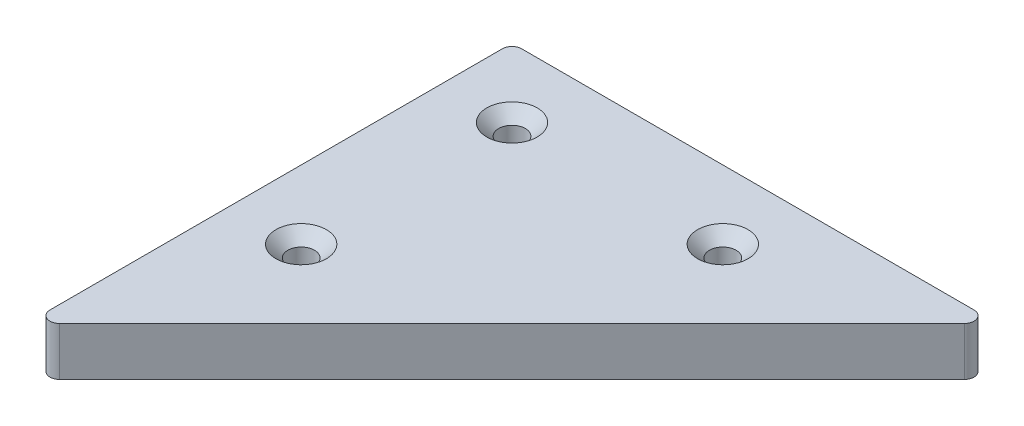
ISO-10303-21;
HEADER;
FILE_DESCRIPTION(('STEP AP214'),'2;1');
FILE_NAME('part.step','',(''),(''),'','','');
FILE_SCHEMA(('AUTOMOTIVE_DESIGN { 1 0 10303 214 1 1 1 1 }'));
ENDSEC;
DATA;
#1=APPLICATION_CONTEXT('core data for automotive mechanical design processes');
#2=APPLICATION_PROTOCOL_DEFINITION('international standard','automotive_design',2000,#1);
#3=PRODUCT_CONTEXT('',#1,'mechanical');
#4=PRODUCT('Part','Part','',(#3));
#5=PRODUCT_RELATED_PRODUCT_CATEGORY('part','',(#4));
#6=PRODUCT_DEFINITION_FORMATION('','',#4);
#7=PRODUCT_DEFINITION_CONTEXT('part definition',#1,'design');
#8=PRODUCT_DEFINITION('design','',#6,#7);
#9=PRODUCT_DEFINITION_SHAPE('','',#8);
#10=(LENGTH_UNIT() NAMED_UNIT(*) SI_UNIT(.MILLI.,.METRE.));
#11=(NAMED_UNIT(*) PLANE_ANGLE_UNIT() SI_UNIT($,.RADIAN.));
#12=(NAMED_UNIT(*) SI_UNIT($,.STERADIAN.) SOLID_ANGLE_UNIT());
#13=UNCERTAINTY_MEASURE_WITH_UNIT(LENGTH_MEASURE(1.E-05),#10,'distance_accuracy_value','');
#14=(GEOMETRIC_REPRESENTATION_CONTEXT(3) GLOBAL_UNCERTAINTY_ASSIGNED_CONTEXT((#13)) GLOBAL_UNIT_ASSIGNED_CONTEXT((#10,
#11,#12)) REPRESENTATION_CONTEXT('',''));
#15=CARTESIAN_POINT('',(0.,0.,0.));
#16=DIRECTION('',(0.,0.,1.));
#17=DIRECTION('',(1.,0.,0.));
#18=AXIS2_PLACEMENT_3D('',#15,#16,#17);
#19=CARTESIAN_POINT('',(100.,10.,0.));
#20=DIRECTION('',(0.,0.,1.));
#21=DIRECTION('',(1.,0.,0.));
#22=AXIS2_PLACEMENT_3D('',#19,#20,#21);
#23=PLANE('',#22);
#24=DIRECTION('',(-1.,0.,0.));
#25=VECTOR('',#24,1.);
#26=CARTESIAN_POINT('',(100.,0.,0.));
#27=LINE('',#26,#25);
#28=CARTESIAN_POINT('',(95.1715728752538,0.,0.));
#29=VERTEX_POINT('',#28);
#30=CARTESIAN_POINT('',(2.,0.,0.));
#31=VERTEX_POINT('',#30);
#32=EDGE_CURVE('E113',#29,#31,#27,.T.);
#33=ORIENTED_EDGE('',*,*,#32,.T.);
#34=DIRECTION('',(0.,-1.,0.));
#35=VECTOR('',#34,1.);
#36=CARTESIAN_POINT('',(2.,10.,0.));
#37=LINE('',#36,#35);
#38=CARTESIAN_POINT('',(2.,10.,0.));
#39=VERTEX_POINT('',#38);
#40=EDGE_CURVE('E92',#31,#39,#37,.F.);
#41=ORIENTED_EDGE('',*,*,#40,.T.);
#42=DIRECTION('',(-1.,0.,0.));
#43=VECTOR('',#42,1.);
#44=CARTESIAN_POINT('',(100.,10.,0.));
#45=LINE('',#44,#43);
#46=CARTESIAN_POINT('',(95.1715728752538,10.,0.));
#47=VERTEX_POINT('',#46);
#48=EDGE_CURVE('E115',#47,#39,#45,.T.);
#49=ORIENTED_EDGE('',*,*,#48,.F.);
#50=DIRECTION('',(0.,-1.,0.));
#51=VECTOR('',#50,1.);
#52=CARTESIAN_POINT('',(95.1715728752538,10.,0.));
#53=LINE('',#52,#51);
#54=EDGE_CURVE('E97',#47,#29,#53,.T.);
#55=ORIENTED_EDGE('',*,*,#54,.T.);
#56=EDGE_LOOP('',(#33,#41,#49,#55));
#57=FACE_BOUND('',#56,.T.);
#58=ADVANCED_FACE('F34',(#57),#23,.F.);
#59=CARTESIAN_POINT('',(0.,10.,0.));
#60=DIRECTION('',(1.,0.,0.));
#61=DIRECTION('',(0.,0.,-1.));
#62=AXIS2_PLACEMENT_3D('',#59,#60,#61);
#63=PLANE('',#62);
#64=DIRECTION('',(0.,0.,1.));
#65=VECTOR('',#64,1.);
#66=CARTESIAN_POINT('',(0.,10.,0.));
#67=LINE('',#66,#65);
#68=CARTESIAN_POINT('',(0.,10.,2.));
#69=VERTEX_POINT('',#68);
#70=CARTESIAN_POINT('',(0.,10.,95.1715728752538));
#71=VERTEX_POINT('',#70);
#72=EDGE_CURVE('E106',#69,#71,#67,.T.);
#73=ORIENTED_EDGE('',*,*,#72,.F.);
#74=DIRECTION('',(0.,-1.,0.));
#75=VECTOR('',#74,1.);
#76=CARTESIAN_POINT('',(0.,10.,2.));
#77=LINE('',#76,#75);
#78=CARTESIAN_POINT('',(0.,0.,2.));
#79=VERTEX_POINT('',#78);
#80=EDGE_CURVE('E91',#69,#79,#77,.T.);
#81=ORIENTED_EDGE('',*,*,#80,.T.);
#82=DIRECTION('',(0.,0.,1.));
#83=VECTOR('',#82,1.);
#84=CARTESIAN_POINT('',(0.,0.,0.));
#85=LINE('',#84,#83);
#86=CARTESIAN_POINT('',(0.,0.,95.1715728752538));
#87=VERTEX_POINT('',#86);
#88=EDGE_CURVE('E104',#79,#87,#85,.T.);
#89=ORIENTED_EDGE('',*,*,#88,.T.);
#90=DIRECTION('',(0.,-1.,0.));
#91=VECTOR('',#90,1.);
#92=CARTESIAN_POINT('',(0.,10.,95.1715728752538));
#93=LINE('',#92,#91);
#94=EDGE_CURVE('E108',#87,#71,#93,.F.);
#95=ORIENTED_EDGE('',*,*,#94,.T.);
#96=EDGE_LOOP('',(#73,#81,#89,#95));
#97=FACE_BOUND('',#96,.T.);
#98=ADVANCED_FACE('F103',(#97),#63,.F.);
#99=CARTESIAN_POINT('',(0.,10.,100.));
#100=DIRECTION('',(-0.707106781186548,0.,-0.707106781186547));
#101=DIRECTION('',(-0.707106781186547,0.,0.707106781186548));
#102=AXIS2_PLACEMENT_3D('',#99,#100,#101);
#103=PLANE('',#102);
#104=DIRECTION('',(0.707106781186547,0.,-0.707106781186548));
#105=VECTOR('',#104,1.);
#106=CARTESIAN_POINT('',(0.,0.,100.));
#107=LINE('',#106,#105);
#108=CARTESIAN_POINT('',(3.4142135623731,0.,96.5857864376269));
#109=VERTEX_POINT('',#108);
#110=CARTESIAN_POINT('',(96.5857864376269,0.,3.41421356237309));
#111=VERTEX_POINT('',#110);
#112=EDGE_CURVE('E112',#109,#111,#107,.T.);
#113=ORIENTED_EDGE('',*,*,#112,.T.);
#114=DIRECTION('',(0.,-1.,0.));
#115=VECTOR('',#114,1.);
#116=CARTESIAN_POINT('',(96.5857864376269,10.,3.41421356237309));
#117=LINE('',#116,#115);
#118=CARTESIAN_POINT('',(96.5857864376269,10.,3.41421356237309));
#119=VERTEX_POINT('',#118);
#120=EDGE_CURVE('E11',#111,#119,#117,.F.);
#121=ORIENTED_EDGE('',*,*,#120,.T.);
#122=DIRECTION('',(0.707106781186547,0.,-0.707106781186548));
#123=VECTOR('',#122,1.);
#124=CARTESIAN_POINT('',(0.,10.,100.));
#125=LINE('',#124,#123);
#126=CARTESIAN_POINT('',(3.4142135623731,10.,96.5857864376269));
#127=VERTEX_POINT('',#126);
#128=EDGE_CURVE('E121',#127,#119,#125,.T.);
#129=ORIENTED_EDGE('',*,*,#128,.F.);
#130=DIRECTION('',(0.,-1.,0.));
#131=VECTOR('',#130,1.);
#132=CARTESIAN_POINT('',(3.4142135623731,10.,96.5857864376269));
#133=LINE('',#132,#131);
#134=EDGE_CURVE('E42',#127,#109,#133,.T.);
#135=ORIENTED_EDGE('',*,*,#134,.T.);
#136=EDGE_LOOP('',(#113,#121,#129,#135));
#137=FACE_BOUND('',#136,.T.);
#138=ADVANCED_FACE('F134',(#137),#103,.F.);
#139=CARTESIAN_POINT('',(0.,10.,0.));
#140=DIRECTION('',(0.,1.,0.));
#141=DIRECTION('',(0.,0.,1.));
#142=AXIS2_PLACEMENT_3D('',#139,#140,#141);
#143=PLANE('',#142);
#144=CARTESIAN_POINT('',(14.1421356237309,10.,14.1421356237309));
#145=DIRECTION('',(0.,1.,0.));
#146=DIRECTION('',(0.,0.,1.));
#147=AXIS2_PLACEMENT_3D('',#144,#145,#146);
#148=CIRCLE('',#147,5.2);
#149=CARTESIAN_POINT('',(14.1421356237309,10.,19.342135623731));
#150=VERTEX_POINT('',#149);
#151=EDGE_CURVE('E299',#150,#150,#148,.T.);
#152=ORIENTED_EDGE('',*,*,#151,.F.);
#153=EDGE_LOOP('',(#152));
#154=FACE_BOUND('',#153,.T.);
#155=CARTESIAN_POINT('',(14.1421356237309,10.,57.5735931288072));
#156=DIRECTION('',(0.,1.,0.));
#157=DIRECTION('',(0.,0.,1.));
#158=AXIS2_PLACEMENT_3D('',#155,#156,#157);
#159=CIRCLE('',#158,5.2);
#160=CARTESIAN_POINT('',(14.1421356237309,10.,62.7735931288072));
#161=VERTEX_POINT('',#160);
#162=EDGE_CURVE('E290',#161,#161,#159,.T.);
#163=ORIENTED_EDGE('',*,*,#162,.F.);
#164=EDGE_LOOP('',(#163));
#165=FACE_BOUND('',#164,.T.);
#166=CARTESIAN_POINT('',(57.5735931288072,10.,14.142135623731));
#167=DIRECTION('',(0.,1.,0.));
#168=DIRECTION('',(0.,0.,1.));
#169=AXIS2_PLACEMENT_3D('',#166,#167,#168);
#170=CIRCLE('',#169,5.2);
#171=CARTESIAN_POINT('',(57.5735931288072,10.,19.342135623731));
#172=VERTEX_POINT('',#171);
#173=EDGE_CURVE('E280',#172,#172,#170,.T.);
#174=ORIENTED_EDGE('',*,*,#173,.F.);
#175=EDGE_LOOP('',(#174));
#176=FACE_BOUND('',#175,.T.);
#177=ORIENTED_EDGE('',*,*,#48,.T.);
#178=CARTESIAN_POINT('',(2.,10.,2.));
#179=DIRECTION('',(0.,1.,0.));
#180=DIRECTION('',(0.,0.,1.));
#181=AXIS2_PLACEMENT_3D('',#178,#179,#180);
#182=CIRCLE('',#181,2.);
#183=EDGE_CURVE('E131',#39,#69,#182,.T.);
#184=ORIENTED_EDGE('',*,*,#183,.T.);
#185=ORIENTED_EDGE('',*,*,#72,.T.);
#186=CARTESIAN_POINT('',(2.00000000000001,10.,95.1715728752538));
#187=DIRECTION('',(0.,1.,0.));
#188=DIRECTION('',(0.,0.,1.));
#189=AXIS2_PLACEMENT_3D('',#186,#187,#188);
#190=CIRCLE('',#189,2.);
#191=EDGE_CURVE('E54',#71,#127,#190,.T.);
#192=ORIENTED_EDGE('',*,*,#191,.T.);
#193=ORIENTED_EDGE('',*,*,#128,.T.);
#194=CARTESIAN_POINT('',(95.1715728752538,10.,2.));
#195=DIRECTION('',(0.,1.,0.));
#196=DIRECTION('',(0.,0.,1.));
#197=AXIS2_PLACEMENT_3D('',#194,#195,#196);
#198=CIRCLE('',#197,2.);
#199=EDGE_CURVE('E129',#119,#47,#198,.T.);
#200=ORIENTED_EDGE('',*,*,#199,.T.);
#201=EDGE_LOOP('',(#177,#184,#185,#192,#193,#200));
#202=FACE_BOUND('',#201,.T.);
#203=ADVANCED_FACE('F147',(#154,#165,#176,#202),#143,.T.);
#204=CARTESIAN_POINT('',(0.,0.,0.));
#205=DIRECTION('',(0.,1.,0.));
#206=DIRECTION('',(0.,0.,1.));
#207=AXIS2_PLACEMENT_3D('',#204,#205,#206);
#208=PLANE('',#207);
#209=CARTESIAN_POINT('',(14.1421356237309,0.,14.1421356237309));
#210=DIRECTION('',(0.,1.,0.));
#211=DIRECTION('',(0.,0.,1.));
#212=AXIS2_PLACEMENT_3D('',#209,#210,#211);
#213=CIRCLE('',#212,2.75);
#214=CARTESIAN_POINT('',(14.1421356237309,0.,16.8921356237309));
#215=VERTEX_POINT('',#214);
#216=EDGE_CURVE('E293',#215,#215,#213,.T.);
#217=ORIENTED_EDGE('',*,*,#216,.T.);
#218=EDGE_LOOP('',(#217));
#219=FACE_BOUND('',#218,.T.);
#220=CARTESIAN_POINT('',(14.1421356237309,0.,57.5735931288072));
#221=DIRECTION('',(0.,1.,0.));
#222=DIRECTION('',(0.,0.,1.));
#223=AXIS2_PLACEMENT_3D('',#220,#221,#222);
#224=CIRCLE('',#223,2.75);
#225=CARTESIAN_POINT('',(14.1421356237309,0.,60.3235931288072));
#226=VERTEX_POINT('',#225);
#227=EDGE_CURVE('E282',#226,#226,#224,.T.);
#228=ORIENTED_EDGE('',*,*,#227,.T.);
#229=EDGE_LOOP('',(#228));
#230=FACE_BOUND('',#229,.T.);
#231=CARTESIAN_POINT('',(57.5735931288072,0.,14.142135623731));
#232=DIRECTION('',(0.,1.,0.));
#233=DIRECTION('',(0.,0.,1.));
#234=AXIS2_PLACEMENT_3D('',#231,#232,#233);
#235=CIRCLE('',#234,2.75);
#236=CARTESIAN_POINT('',(57.5735931288072,0.,16.892135623731));
#237=VERTEX_POINT('',#236);
#238=EDGE_CURVE('E117',#237,#237,#235,.T.);
#239=ORIENTED_EDGE('',*,*,#238,.T.);
#240=EDGE_LOOP('',(#239));
#241=FACE_BOUND('',#240,.T.);
#242=ORIENTED_EDGE('',*,*,#88,.F.);
#243=CARTESIAN_POINT('',(2.,0.,2.));
#244=DIRECTION('',(0.,1.,0.));
#245=DIRECTION('',(0.,0.,1.));
#246=AXIS2_PLACEMENT_3D('',#243,#244,#245);
#247=CIRCLE('',#246,2.);
#248=EDGE_CURVE('E87',#79,#31,#247,.F.);
#249=ORIENTED_EDGE('',*,*,#248,.T.);
#250=ORIENTED_EDGE('',*,*,#32,.F.);
#251=CARTESIAN_POINT('',(95.1715728752538,0.,2.));
#252=DIRECTION('',(0.,1.,0.));
#253=DIRECTION('',(0.,0.,1.));
#254=AXIS2_PLACEMENT_3D('',#251,#252,#253);
#255=CIRCLE('',#254,2.);
#256=EDGE_CURVE('E98',#29,#111,#255,.F.);
#257=ORIENTED_EDGE('',*,*,#256,.T.);
#258=ORIENTED_EDGE('',*,*,#112,.F.);
#259=CARTESIAN_POINT('',(2.00000000000001,0.,95.1715728752538));
#260=DIRECTION('',(0.,1.,0.));
#261=DIRECTION('',(0.,0.,1.));
#262=AXIS2_PLACEMENT_3D('',#259,#260,#261);
#263=CIRCLE('',#262,2.);
#264=EDGE_CURVE('E107',#109,#87,#263,.F.);
#265=ORIENTED_EDGE('',*,*,#264,.T.);
#266=EDGE_LOOP('',(#242,#249,#250,#257,#258,#265));
#267=FACE_BOUND('',#266,.T.);
#268=ADVANCED_FACE('F110',(#219,#230,#241,#267),#208,.F.);
#269=CARTESIAN_POINT('',(57.5735931288072,10.,14.142135623731));
#270=DIRECTION('',(0.,1.,0.));
#271=DIRECTION('',(0.,0.,1.));
#272=AXIS2_PLACEMENT_3D('',#269,#270,#271);
#273=CYLINDRICAL_SURFACE('',#272,2.75);
#274=ORIENTED_EDGE('',*,*,#238,.F.);
#275=EDGE_LOOP('',(#274));
#276=FACE_BOUND('',#275,.T.);
#277=CARTESIAN_POINT('',(57.5735931288072,7.55,14.142135623731));
#278=DIRECTION('',(0.,1.,0.));
#279=DIRECTION('',(0.,0.,1.));
#280=AXIS2_PLACEMENT_3D('',#277,#278,#279);
#281=CIRCLE('',#280,2.75);
#282=CARTESIAN_POINT('',(57.5735931288072,7.55,16.892135623731));
#283=VERTEX_POINT('',#282);
#284=EDGE_CURVE('E279',#283,#283,#281,.T.);
#285=ORIENTED_EDGE('',*,*,#284,.T.);
#286=EDGE_LOOP('',(#285));
#287=FACE_BOUND('',#286,.T.);
#288=ADVANCED_FACE('F155',(#276,#287),#273,.F.);
#289=CARTESIAN_POINT('',(57.5735931288072,10.,14.142135623731));
#290=DIRECTION('',(0.,1.,0.));
#291=DIRECTION('',(0.,0.,1.));
#292=AXIS2_PLACEMENT_3D('',#289,#290,#291);
#293=CONICAL_SURFACE('',#292,5.2,0.785398163397449);
#294=ORIENTED_EDGE('',*,*,#284,.F.);
#295=EDGE_LOOP('',(#294));
#296=FACE_BOUND('',#295,.T.);
#297=ORIENTED_EDGE('',*,*,#173,.T.);
#298=EDGE_LOOP('',(#297));
#299=FACE_BOUND('',#298,.T.);
#300=ADVANCED_FACE('F254',(#296,#299),#293,.F.);
#301=CARTESIAN_POINT('',(14.1421356237309,10.,57.5735931288072));
#302=DIRECTION('',(0.,1.,0.));
#303=DIRECTION('',(0.,0.,1.));
#304=AXIS2_PLACEMENT_3D('',#301,#302,#303);
#305=CYLINDRICAL_SURFACE('',#304,2.75);
#306=ORIENTED_EDGE('',*,*,#227,.F.);
#307=EDGE_LOOP('',(#306));
#308=FACE_BOUND('',#307,.T.);
#309=CARTESIAN_POINT('',(14.1421356237309,7.55,57.5735931288072));
#310=DIRECTION('',(0.,1.,0.));
#311=DIRECTION('',(0.,0.,1.));
#312=AXIS2_PLACEMENT_3D('',#309,#310,#311);
#313=CIRCLE('',#312,2.75);
#314=CARTESIAN_POINT('',(14.1421356237309,7.55,60.3235931288072));
#315=VERTEX_POINT('',#314);
#316=EDGE_CURVE('E287',#315,#315,#313,.T.);
#317=ORIENTED_EDGE('',*,*,#316,.T.);
#318=EDGE_LOOP('',(#317));
#319=FACE_BOUND('',#318,.T.);
#320=ADVANCED_FACE('F244',(#308,#319),#305,.F.);
#321=CARTESIAN_POINT('',(14.1421356237309,10.,57.5735931288072));
#322=DIRECTION('',(0.,1.,0.));
#323=DIRECTION('',(0.,0.,1.));
#324=AXIS2_PLACEMENT_3D('',#321,#322,#323);
#325=CONICAL_SURFACE('',#324,5.2,0.785398163397448);
#326=ORIENTED_EDGE('',*,*,#316,.F.);
#327=EDGE_LOOP('',(#326));
#328=FACE_BOUND('',#327,.T.);
#329=ORIENTED_EDGE('',*,*,#162,.T.);
#330=EDGE_LOOP('',(#329));
#331=FACE_BOUND('',#330,.T.);
#332=ADVANCED_FACE('F234',(#328,#331),#325,.F.);
#333=CARTESIAN_POINT('',(14.1421356237309,10.,14.1421356237309));
#334=DIRECTION('',(0.,1.,0.));
#335=DIRECTION('',(0.,0.,1.));
#336=AXIS2_PLACEMENT_3D('',#333,#334,#335);
#337=CYLINDRICAL_SURFACE('',#336,2.75);
#338=ORIENTED_EDGE('',*,*,#216,.F.);
#339=EDGE_LOOP('',(#338));
#340=FACE_BOUND('',#339,.T.);
#341=CARTESIAN_POINT('',(14.1421356237309,7.55,14.1421356237309));
#342=DIRECTION('',(0.,1.,0.));
#343=DIRECTION('',(0.,0.,1.));
#344=AXIS2_PLACEMENT_3D('',#341,#342,#343);
#345=CIRCLE('',#344,2.75);
#346=CARTESIAN_POINT('',(14.1421356237309,7.55,16.8921356237309));
#347=VERTEX_POINT('',#346);
#348=EDGE_CURVE('E296',#347,#347,#345,.T.);
#349=ORIENTED_EDGE('',*,*,#348,.T.);
#350=EDGE_LOOP('',(#349));
#351=FACE_BOUND('',#350,.T.);
#352=ADVANCED_FACE('F224',(#340,#351),#337,.F.);
#353=CARTESIAN_POINT('',(14.1421356237309,10.,14.1421356237309));
#354=DIRECTION('',(0.,1.,0.));
#355=DIRECTION('',(0.,0.,1.));
#356=AXIS2_PLACEMENT_3D('',#353,#354,#355);
#357=CONICAL_SURFACE('',#356,5.2,0.785398163397448);
#358=ORIENTED_EDGE('',*,*,#348,.F.);
#359=EDGE_LOOP('',(#358));
#360=FACE_BOUND('',#359,.T.);
#361=ORIENTED_EDGE('',*,*,#151,.T.);
#362=EDGE_LOOP('',(#361));
#363=FACE_BOUND('',#362,.T.);
#364=ADVANCED_FACE('F170',(#360,#363),#357,.F.);
#365=CARTESIAN_POINT('',(2.,10.,2.));
#366=DIRECTION('',(0.,-1.,0.));
#367=DIRECTION('',(0.,0.,-1.));
#368=AXIS2_PLACEMENT_3D('',#365,#366,#367);
#369=CYLINDRICAL_SURFACE('',#368,2.);
#370=ORIENTED_EDGE('',*,*,#183,.F.);
#371=ORIENTED_EDGE('',*,*,#40,.F.);
#372=ORIENTED_EDGE('',*,*,#248,.F.);
#373=ORIENTED_EDGE('',*,*,#80,.F.);
#374=EDGE_LOOP('',(#370,#371,#372,#373));
#375=FACE_BOUND('',#374,.T.);
#376=ADVANCED_FACE('F90',(#375),#369,.T.);
#377=CARTESIAN_POINT('',(95.1715728752538,10.,2.));
#378=DIRECTION('',(0.,-1.,0.));
#379=DIRECTION('',(0.,0.,-1.));
#380=AXIS2_PLACEMENT_3D('',#377,#378,#379);
#381=CYLINDRICAL_SURFACE('',#380,2.);
#382=ORIENTED_EDGE('',*,*,#199,.F.);
#383=ORIENTED_EDGE('',*,*,#120,.F.);
#384=ORIENTED_EDGE('',*,*,#256,.F.);
#385=ORIENTED_EDGE('',*,*,#54,.F.);
#386=EDGE_LOOP('',(#382,#383,#384,#385));
#387=FACE_BOUND('',#386,.T.);
#388=ADVANCED_FACE('F139',(#387),#381,.T.);
#389=CARTESIAN_POINT('',(2.00000000000001,10.,95.1715728752538));
#390=DIRECTION('',(0.,-1.,0.));
#391=DIRECTION('',(0.,0.,-1.));
#392=AXIS2_PLACEMENT_3D('',#389,#390,#391);
#393=CYLINDRICAL_SURFACE('',#392,2.);
#394=ORIENTED_EDGE('',*,*,#191,.F.);
#395=ORIENTED_EDGE('',*,*,#94,.F.);
#396=ORIENTED_EDGE('',*,*,#264,.F.);
#397=ORIENTED_EDGE('',*,*,#134,.F.);
#398=EDGE_LOOP('',(#394,#395,#396,#397));
#399=FACE_BOUND('',#398,.T.);
#400=ADVANCED_FACE('F36',(#399),#393,.T.);
#401=CLOSED_SHELL('',(#58,#98,#138,#203,#268,#288,#300,#320,#332,#352,#364,#376,#388,#400));
#402=MANIFOLD_SOLID_BREP('B2',#401);
#403=ADVANCED_BREP_SHAPE_REPRESENTATION('',(#18,#402),#14);
#404=SHAPE_DEFINITION_REPRESENTATION(#9,#403);
ENDSEC;
END-ISO-10303-21;
